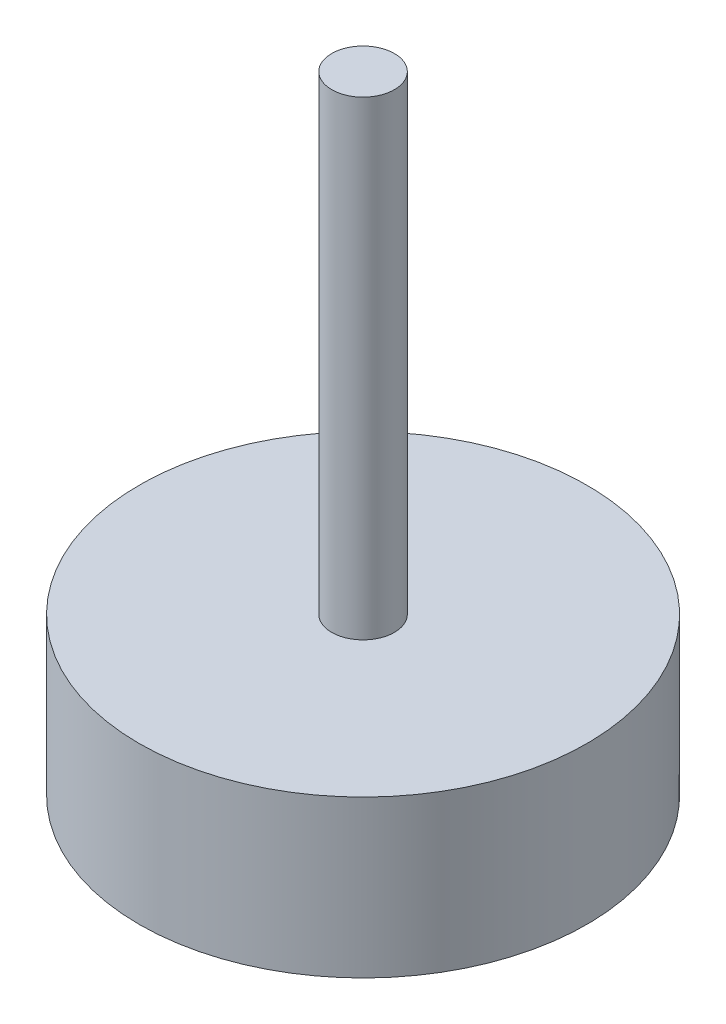
ISO-10303-21;
HEADER;
FILE_DESCRIPTION(('STEP AP214'),'2;1');
FILE_NAME('part.step','',(''),(''),'','','');
FILE_SCHEMA(('AUTOMOTIVE_DESIGN { 1 0 10303 214 1 1 1 1 }'));
ENDSEC;
DATA;
#1=APPLICATION_CONTEXT('core data for automotive mechanical design processes');
#2=APPLICATION_PROTOCOL_DEFINITION('international standard','automotive_design',2000,#1);
#3=PRODUCT_CONTEXT('',#1,'mechanical');
#4=PRODUCT('Part','Part','',(#3));
#5=PRODUCT_RELATED_PRODUCT_CATEGORY('part','',(#4));
#6=PRODUCT_DEFINITION_FORMATION('','',#4);
#7=PRODUCT_DEFINITION_CONTEXT('part definition',#1,'design');
#8=PRODUCT_DEFINITION('design','',#6,#7);
#9=PRODUCT_DEFINITION_SHAPE('','',#8);
#10=(LENGTH_UNIT() NAMED_UNIT(*) SI_UNIT(.MILLI.,.METRE.));
#11=(NAMED_UNIT(*) PLANE_ANGLE_UNIT() SI_UNIT($,.RADIAN.));
#12=(NAMED_UNIT(*) SI_UNIT($,.STERADIAN.) SOLID_ANGLE_UNIT());
#13=UNCERTAINTY_MEASURE_WITH_UNIT(LENGTH_MEASURE(1.E-05),#10,'distance_accuracy_value','');
#14=(GEOMETRIC_REPRESENTATION_CONTEXT(3) GLOBAL_UNCERTAINTY_ASSIGNED_CONTEXT((#13)) GLOBAL_UNIT_ASSIGNED_CONTEXT((#10,
#11,#12)) REPRESENTATION_CONTEXT('',''));
#15=CARTESIAN_POINT('',(0.,0.,0.));
#16=DIRECTION('',(0.,0.,1.));
#17=DIRECTION('',(1.,0.,0.));
#18=AXIS2_PLACEMENT_3D('',#15,#16,#17);
#19=CARTESIAN_POINT('',(0.,14.,0.));
#20=DIRECTION('',(0.,-1.,0.));
#21=DIRECTION('',(0.,0.,-1.));
#22=AXIS2_PLACEMENT_3D('',#19,#20,#21);
#23=CYLINDRICAL_SURFACE('',#22,5.);
#24=CARTESIAN_POINT('',(0.,0.,0.));
#25=DIRECTION('',(0.,1.,0.));
#26=DIRECTION('',(0.,0.,1.));
#27=AXIS2_PLACEMENT_3D('',#24,#25,#26);
#28=CIRCLE('',#27,5.);
#29=CARTESIAN_POINT('',(0.,0.,5.));
#30=VERTEX_POINT('',#29);
#31=EDGE_CURVE('E11',#30,#30,#28,.T.);
#32=ORIENTED_EDGE('',*,*,#31,.T.);
#33=EDGE_LOOP('',(#32));
#34=FACE_BOUND('',#33,.T.);
#35=CARTESIAN_POINT('',(0.,3.5,0.));
#36=DIRECTION('',(0.,1.,0.));
#37=DIRECTION('',(0.,0.,1.));
#38=AXIS2_PLACEMENT_3D('',#35,#36,#37);
#39=CIRCLE('',#38,5.);
#40=CARTESIAN_POINT('',(0.,3.5,5.));
#41=VERTEX_POINT('',#40);
#42=EDGE_CURVE('E51',#41,#41,#39,.F.);
#43=ORIENTED_EDGE('',*,*,#42,.T.);
#44=EDGE_LOOP('',(#43));
#45=FACE_BOUND('',#44,.T.);
#46=ADVANCED_FACE('F39',(#34,#45),#23,.T.);
#47=CARTESIAN_POINT('',(0.,0.,0.));
#48=DIRECTION('',(0.,1.,0.));
#49=DIRECTION('',(0.,0.,1.));
#50=AXIS2_PLACEMENT_3D('',#47,#48,#49);
#51=PLANE('',#50);
#52=ORIENTED_EDGE('',*,*,#31,.F.);
#53=EDGE_LOOP('',(#52));
#54=FACE_BOUND('',#53,.T.);
#55=ADVANCED_FACE('F68',(#54),#51,.F.);
#56=CARTESIAN_POINT('',(0.,-14.142135623731,0.));
#57=DIRECTION('',(0.,1.,0.));
#58=DIRECTION('',(0.,0.,1.));
#59=AXIS2_PLACEMENT_3D('',#56,#57,#58);
#60=CYLINDRICAL_SURFACE('',#59,0.7);
#61=CARTESIAN_POINT('',(0.,3.5,0.));
#62=DIRECTION('',(0.,1.,0.));
#63=DIRECTION('',(0.,0.,1.));
#64=AXIS2_PLACEMENT_3D('',#61,#62,#63);
#65=CIRCLE('',#64,0.7);
#66=CARTESIAN_POINT('',(0.,3.5,0.7));
#67=VERTEX_POINT('',#66);
#68=EDGE_CURVE('E46',#67,#67,#65,.F.);
#69=ORIENTED_EDGE('',*,*,#68,.F.);
#70=EDGE_LOOP('',(#69));
#71=FACE_BOUND('',#70,.T.);
#72=CARTESIAN_POINT('',(0.,14.,0.));
#73=DIRECTION('',(0.,1.,0.));
#74=DIRECTION('',(0.,0.,1.));
#75=AXIS2_PLACEMENT_3D('',#72,#73,#74);
#76=CIRCLE('',#75,0.7);
#77=CARTESIAN_POINT('',(0.,14.,0.7));
#78=VERTEX_POINT('',#77);
#79=EDGE_CURVE('E56',#78,#78,#76,.T.);
#80=ORIENTED_EDGE('',*,*,#79,.F.);
#81=EDGE_LOOP('',(#80));
#82=FACE_BOUND('',#81,.T.);
#83=ADVANCED_FACE('F65',(#71,#82),#60,.T.);
#84=CARTESIAN_POINT('',(0.,3.5,0.));
#85=DIRECTION('',(0.,1.,0.));
#86=DIRECTION('',(0.,0.,1.));
#87=AXIS2_PLACEMENT_3D('',#84,#85,#86);
#88=PLANE('',#87);
#89=ORIENTED_EDGE('',*,*,#42,.F.);
#90=EDGE_LOOP('',(#89));
#91=FACE_BOUND('',#90,.T.);
#92=ORIENTED_EDGE('',*,*,#68,.T.);
#93=EDGE_LOOP('',(#92));
#94=FACE_BOUND('',#93,.T.);
#95=ADVANCED_FACE('F67',(#91,#94),#88,.T.);
#96=CARTESIAN_POINT('',(0.,14.,0.));
#97=DIRECTION('',(0.,1.,0.));
#98=DIRECTION('',(0.,0.,1.));
#99=AXIS2_PLACEMENT_3D('',#96,#97,#98);
#100=PLANE('',#99);
#101=ORIENTED_EDGE('',*,*,#79,.T.);
#102=EDGE_LOOP('',(#101));
#103=FACE_BOUND('',#102,.T.);
#104=ADVANCED_FACE('F63',(#103),#100,.T.);
#105=CLOSED_SHELL('',(#46,#55,#83,#95,#104));
#106=MANIFOLD_SOLID_BREP('B2',#105);
#107=ADVANCED_BREP_SHAPE_REPRESENTATION('',(#18,#106),#14);
#108=SHAPE_DEFINITION_REPRESENTATION(#9,#107);
ENDSEC;
END-ISO-10303-21;
